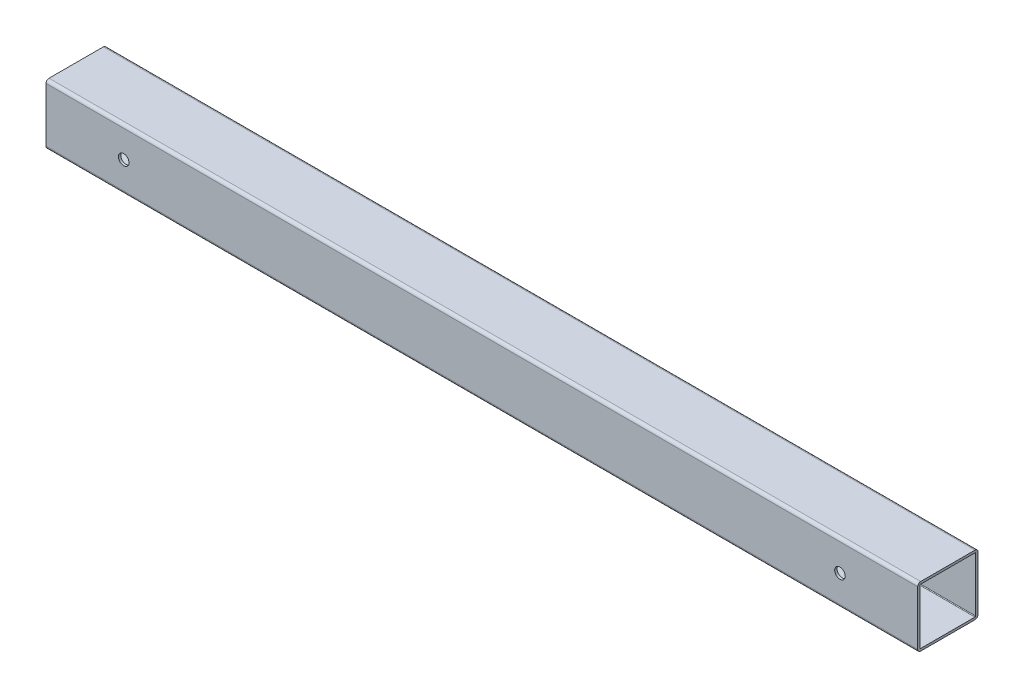
ISO-10303-21;
HEADER;
FILE_DESCRIPTION(('STEP AP214'),'2;1');
FILE_NAME('part.step','',(''),(''),'','','');
FILE_SCHEMA(('AUTOMOTIVE_DESIGN { 1 0 10303 214 1 1 1 1 }'));
ENDSEC;
DATA;
#1=APPLICATION_CONTEXT('core data for automotive mechanical design processes');
#2=APPLICATION_PROTOCOL_DEFINITION('international standard','automotive_design',2000,#1);
#3=PRODUCT_CONTEXT('',#1,'mechanical');
#4=PRODUCT('Part','Part','',(#3));
#5=PRODUCT_RELATED_PRODUCT_CATEGORY('part','',(#4));
#6=PRODUCT_DEFINITION_FORMATION('','',#4);
#7=PRODUCT_DEFINITION_CONTEXT('part definition',#1,'design');
#8=PRODUCT_DEFINITION('design','',#6,#7);
#9=PRODUCT_DEFINITION_SHAPE('','',#8);
#10=(LENGTH_UNIT() NAMED_UNIT(*) SI_UNIT(.MILLI.,.METRE.));
#11=(NAMED_UNIT(*) PLANE_ANGLE_UNIT() SI_UNIT($,.RADIAN.));
#12=(NAMED_UNIT(*) SI_UNIT($,.STERADIAN.) SOLID_ANGLE_UNIT());
#13=UNCERTAINTY_MEASURE_WITH_UNIT(LENGTH_MEASURE(1.E-05),#10,'distance_accuracy_value','');
#14=(GEOMETRIC_REPRESENTATION_CONTEXT(3) GLOBAL_UNCERTAINTY_ASSIGNED_CONTEXT((#13)) GLOBAL_UNIT_ASSIGNED_CONTEXT((#10,
#11,#12)) REPRESENTATION_CONTEXT('',''));
#15=CARTESIAN_POINT('',(0.,0.,0.));
#16=DIRECTION('',(0.,0.,1.));
#17=DIRECTION('',(1.,0.,0.));
#18=AXIS2_PLACEMENT_3D('',#15,#16,#17);
#19=CARTESIAN_POINT('',(289.026800000006,18.,18.));
#20=DIRECTION('',(-1.,0.,0.));
#21=DIRECTION('',(0.,-1.,0.));
#22=AXIS2_PLACEMENT_3D('',#19,#20,#21);
#23=CYLINDRICAL_SURFACE('',#22,2.00000000000001);
#24=CARTESIAN_POINT('',(-289.026800000006,17.9999999999999,18.));
#25=DIRECTION('',(1.,0.,0.));
#26=DIRECTION('',(0.,1.,0.));
#27=AXIS2_PLACEMENT_3D('',#24,#25,#26);
#28=CIRCLE('',#27,2.00000000000001);
#29=CARTESIAN_POINT('',(-289.026800000006,19.9999999999999,18.));
#30=VERTEX_POINT('',#29);
#31=CARTESIAN_POINT('',(-289.026800000006,17.9999999999999,20.));
#32=VERTEX_POINT('',#31);
#33=EDGE_CURVE('E238',#30,#32,#28,.T.);
#34=ORIENTED_EDGE('',*,*,#33,.T.);
#35=DIRECTION('',(-1.,0.,0.));
#36=VECTOR('',#35,1.);
#37=CARTESIAN_POINT('',(289.026800000006,18.,20.));
#38=LINE('',#37,#36);
#39=CARTESIAN_POINT('',(289.026800000006,18.,20.));
#40=VERTEX_POINT('',#39);
#41=EDGE_CURVE('E12',#40,#32,#38,.T.);
#42=ORIENTED_EDGE('',*,*,#41,.F.);
#43=CARTESIAN_POINT('',(289.026800000006,18.,18.));
#44=DIRECTION('',(1.,0.,0.));
#45=DIRECTION('',(0.,1.,0.));
#46=AXIS2_PLACEMENT_3D('',#43,#44,#45);
#47=CIRCLE('',#46,2.00000000000001);
#48=CARTESIAN_POINT('',(289.026800000006,20.,18.));
#49=VERTEX_POINT('',#48);
#50=EDGE_CURVE('E324',#49,#40,#47,.T.);
#51=ORIENTED_EDGE('',*,*,#50,.F.);
#52=DIRECTION('',(-1.,0.,0.));
#53=VECTOR('',#52,1.);
#54=CARTESIAN_POINT('',(289.026800000006,20.,18.));
#55=LINE('',#54,#53);
#56=EDGE_CURVE('E253',#49,#30,#55,.T.);
#57=ORIENTED_EDGE('',*,*,#56,.T.);
#58=EDGE_LOOP('',(#34,#42,#51,#57));
#59=FACE_BOUND('',#58,.T.);
#60=ADVANCED_FACE('F64',(#59),#23,.T.);
#61=CARTESIAN_POINT('',(289.026800000006,18.,20.));
#62=DIRECTION('',(0.,0.,-1.));
#63=DIRECTION('',(0.,1.,0.));
#64=AXIS2_PLACEMENT_3D('',#61,#62,#63);
#65=PLANE('',#64);
#66=CARTESIAN_POINT('',(237.500000000003,-1.04249065572092E-13,20.));
#67=DIRECTION('',(0.,0.,-1.));
#68=DIRECTION('',(0.,1.,0.));
#69=AXIS2_PLACEMENT_3D('',#66,#67,#68);
#70=CIRCLE('',#69,3.49999999999999);
#71=CARTESIAN_POINT('',(237.500000000003,3.49999999999989,20.));
#72=VERTEX_POINT('',#71);
#73=EDGE_CURVE('E281',#72,#72,#70,.T.);
#74=ORIENTED_EDGE('',*,*,#73,.T.);
#75=EDGE_LOOP('',(#74));
#76=FACE_BOUND('',#75,.T.);
#77=CARTESIAN_POINT('',(-237.500000000003,0.,20.));
#78=DIRECTION('',(0.,0.,-1.));
#79=DIRECTION('',(0.,-1.,0.));
#80=AXIS2_PLACEMENT_3D('',#77,#78,#79);
#81=CIRCLE('',#80,3.49999999999999);
#82=CARTESIAN_POINT('',(-237.500000000003,-3.50000000000004,20.));
#83=VERTEX_POINT('',#82);
#84=EDGE_CURVE('E288',#83,#83,#81,.T.);
#85=ORIENTED_EDGE('',*,*,#84,.T.);
#86=EDGE_LOOP('',(#85));
#87=FACE_BOUND('',#86,.T.);
#88=DIRECTION('',(0.,-1.,0.));
#89=VECTOR('',#88,1.);
#90=CARTESIAN_POINT('',(-289.026800000006,17.9999999999999,20.));
#91=LINE('',#90,#89);
#92=CARTESIAN_POINT('',(-289.026800000006,-18.0000000000001,20.));
#93=VERTEX_POINT('',#92);
#94=EDGE_CURVE('E241',#32,#93,#91,.T.);
#95=ORIENTED_EDGE('',*,*,#94,.T.);
#96=DIRECTION('',(-1.,0.,0.));
#97=VECTOR('',#96,1.);
#98=CARTESIAN_POINT('',(289.026800000006,-18.,20.));
#99=LINE('',#98,#97);
#100=CARTESIAN_POINT('',(289.026800000006,-18.,20.));
#101=VERTEX_POINT('',#100);
#102=EDGE_CURVE('E74',#101,#93,#99,.T.);
#103=ORIENTED_EDGE('',*,*,#102,.F.);
#104=DIRECTION('',(0.,-1.,0.));
#105=VECTOR('',#104,1.);
#106=CARTESIAN_POINT('',(289.026800000006,18.,20.));
#107=LINE('',#106,#105);
#108=EDGE_CURVE('E326',#40,#101,#107,.T.);
#109=ORIENTED_EDGE('',*,*,#108,.F.);
#110=ORIENTED_EDGE('',*,*,#41,.T.);
#111=EDGE_LOOP('',(#95,#103,#109,#110));
#112=FACE_BOUND('',#111,.T.);
#113=ADVANCED_FACE('F364',(#76,#87,#112),#65,.F.);
#114=CARTESIAN_POINT('',(289.026800000006,-18.,18.));
#115=DIRECTION('',(-1.,0.,0.));
#116=DIRECTION('',(0.,-1.,0.));
#117=AXIS2_PLACEMENT_3D('',#114,#115,#116);
#118=CYLINDRICAL_SURFACE('',#117,2.00000000000001);
#119=CARTESIAN_POINT('',(-289.026800000006,-18.0000000000001,18.));
#120=DIRECTION('',(1.,0.,0.));
#121=DIRECTION('',(0.,1.,0.));
#122=AXIS2_PLACEMENT_3D('',#119,#120,#121);
#123=CIRCLE('',#122,2.00000000000001);
#124=CARTESIAN_POINT('',(-289.026800000006,-20.0000000000001,18.));
#125=VERTEX_POINT('',#124);
#126=EDGE_CURVE('E243',#93,#125,#123,.T.);
#127=ORIENTED_EDGE('',*,*,#126,.T.);
#128=DIRECTION('',(-1.,0.,0.));
#129=VECTOR('',#128,1.);
#130=CARTESIAN_POINT('',(289.026800000006,-20.,18.));
#131=LINE('',#130,#129);
#132=CARTESIAN_POINT('',(289.026800000006,-20.,18.));
#133=VERTEX_POINT('',#132);
#134=EDGE_CURVE('E260',#133,#125,#131,.T.);
#135=ORIENTED_EDGE('',*,*,#134,.F.);
#136=CARTESIAN_POINT('',(289.026800000006,-18.,18.));
#137=DIRECTION('',(1.,0.,0.));
#138=DIRECTION('',(0.,1.,0.));
#139=AXIS2_PLACEMENT_3D('',#136,#137,#138);
#140=CIRCLE('',#139,2.00000000000001);
#141=EDGE_CURVE('E328',#101,#133,#140,.T.);
#142=ORIENTED_EDGE('',*,*,#141,.F.);
#143=ORIENTED_EDGE('',*,*,#102,.T.);
#144=EDGE_LOOP('',(#127,#135,#142,#143));
#145=FACE_BOUND('',#144,.T.);
#146=ADVANCED_FACE('F369',(#145),#118,.T.);
#147=CARTESIAN_POINT('',(289.026800000006,-20.,-18.));
#148=DIRECTION('',(0.,1.,0.));
#149=DIRECTION('',(0.,0.,1.));
#150=AXIS2_PLACEMENT_3D('',#147,#148,#149);
#151=PLANE('',#150);
#152=DIRECTION('',(0.,0.,-1.));
#153=VECTOR('',#152,1.);
#154=CARTESIAN_POINT('',(-289.026800000006,-20.0000000000001,-18.));
#155=LINE('',#154,#153);
#156=CARTESIAN_POINT('',(-289.026800000006,-20.0000000000001,-18.));
#157=VERTEX_POINT('',#156);
#158=EDGE_CURVE('E245',#125,#157,#155,.T.);
#159=ORIENTED_EDGE('',*,*,#158,.T.);
#160=DIRECTION('',(-1.,0.,0.));
#161=VECTOR('',#160,1.);
#162=CARTESIAN_POINT('',(289.026800000006,-20.,-18.));
#163=LINE('',#162,#161);
#164=CARTESIAN_POINT('',(289.026800000006,-20.,-18.));
#165=VERTEX_POINT('',#164);
#166=EDGE_CURVE('E257',#165,#157,#163,.T.);
#167=ORIENTED_EDGE('',*,*,#166,.F.);
#168=DIRECTION('',(0.,0.,-1.));
#169=VECTOR('',#168,1.);
#170=CARTESIAN_POINT('',(289.026800000006,-20.,-18.));
#171=LINE('',#170,#169);
#172=EDGE_CURVE('E330',#133,#165,#171,.T.);
#173=ORIENTED_EDGE('',*,*,#172,.F.);
#174=ORIENTED_EDGE('',*,*,#134,.T.);
#175=EDGE_LOOP('',(#159,#167,#173,#174));
#176=FACE_BOUND('',#175,.T.);
#177=ADVANCED_FACE('F336',(#176),#151,.F.);
#178=CARTESIAN_POINT('',(289.026800000006,-18.,-18.));
#179=DIRECTION('',(-1.,0.,0.));
#180=DIRECTION('',(0.,-1.,0.));
#181=AXIS2_PLACEMENT_3D('',#178,#179,#180);
#182=CYLINDRICAL_SURFACE('',#181,2.00000000000001);
#183=CARTESIAN_POINT('',(-289.026800000006,-18.0000000000001,-18.));
#184=DIRECTION('',(1.,0.,0.));
#185=DIRECTION('',(0.,1.,0.));
#186=AXIS2_PLACEMENT_3D('',#183,#184,#185);
#187=CIRCLE('',#186,2.00000000000001);
#188=CARTESIAN_POINT('',(-289.026800000006,-18.0000000000001,-20.));
#189=VERTEX_POINT('',#188);
#190=EDGE_CURVE('E247',#157,#189,#187,.T.);
#191=ORIENTED_EDGE('',*,*,#190,.T.);
#192=DIRECTION('',(-1.,0.,0.));
#193=VECTOR('',#192,1.);
#194=CARTESIAN_POINT('',(289.026800000006,-18.,-20.));
#195=LINE('',#194,#193);
#196=CARTESIAN_POINT('',(289.026800000006,-18.,-20.));
#197=VERTEX_POINT('',#196);
#198=EDGE_CURVE('E204',#197,#189,#195,.T.);
#199=ORIENTED_EDGE('',*,*,#198,.F.);
#200=CARTESIAN_POINT('',(289.026800000006,-18.,-18.));
#201=DIRECTION('',(1.,0.,0.));
#202=DIRECTION('',(0.,1.,0.));
#203=AXIS2_PLACEMENT_3D('',#200,#201,#202);
#204=CIRCLE('',#203,2.00000000000001);
#205=EDGE_CURVE('E195',#165,#197,#204,.T.);
#206=ORIENTED_EDGE('',*,*,#205,.F.);
#207=ORIENTED_EDGE('',*,*,#166,.T.);
#208=EDGE_LOOP('',(#191,#199,#206,#207));
#209=FACE_BOUND('',#208,.T.);
#210=ADVANCED_FACE('F340',(#209),#182,.T.);
#211=CARTESIAN_POINT('',(289.026800000006,-18.,-20.));
#212=DIRECTION('',(0.,0.,1.));
#213=DIRECTION('',(0.,-1.,0.));
#214=AXIS2_PLACEMENT_3D('',#211,#212,#213);
#215=PLANE('',#214);
#216=CARTESIAN_POINT('',(237.500000000003,-1.08104006629818E-13,-20.));
#217=DIRECTION('',(0.,0.,1.));
#218=DIRECTION('',(0.,-1.,0.));
#219=AXIS2_PLACEMENT_3D('',#216,#217,#218);
#220=CIRCLE('',#219,3.49999999999999);
#221=CARTESIAN_POINT('',(237.500000000003,-3.5000000000001,-20.));
#222=VERTEX_POINT('',#221);
#223=EDGE_CURVE('E217',#222,#222,#220,.T.);
#224=ORIENTED_EDGE('',*,*,#223,.T.);
#225=EDGE_LOOP('',(#224));
#226=FACE_BOUND('',#225,.T.);
#227=CARTESIAN_POINT('',(-237.500000000003,0.,-20.));
#228=DIRECTION('',(0.,0.,1.));
#229=DIRECTION('',(0.,-1.,0.));
#230=AXIS2_PLACEMENT_3D('',#227,#228,#229);
#231=CIRCLE('',#230,3.49999999999999);
#232=CARTESIAN_POINT('',(-237.500000000003,-3.50000000000004,-20.));
#233=VERTEX_POINT('',#232);
#234=EDGE_CURVE('E285',#233,#233,#231,.T.);
#235=ORIENTED_EDGE('',*,*,#234,.T.);
#236=EDGE_LOOP('',(#235));
#237=FACE_BOUND('',#236,.T.);
#238=DIRECTION('',(0.,1.,0.));
#239=VECTOR('',#238,1.);
#240=CARTESIAN_POINT('',(-289.026800000006,-18.0000000000001,-20.));
#241=LINE('',#240,#239);
#242=CARTESIAN_POINT('',(-289.026800000006,17.9999999999999,-20.));
#243=VERTEX_POINT('',#242);
#244=EDGE_CURVE('E203',#189,#243,#241,.T.);
#245=ORIENTED_EDGE('',*,*,#244,.T.);
#246=DIRECTION('',(-1.,0.,0.));
#247=VECTOR('',#246,1.);
#248=CARTESIAN_POINT('',(289.026800000006,18.,-20.));
#249=LINE('',#248,#247);
#250=CARTESIAN_POINT('',(289.026800000006,18.,-20.));
#251=VERTEX_POINT('',#250);
#252=EDGE_CURVE('E200',#251,#243,#249,.T.);
#253=ORIENTED_EDGE('',*,*,#252,.F.);
#254=DIRECTION('',(0.,1.,0.));
#255=VECTOR('',#254,1.);
#256=CARTESIAN_POINT('',(289.026800000006,-18.,-20.));
#257=LINE('',#256,#255);
#258=EDGE_CURVE('E189',#197,#251,#257,.T.);
#259=ORIENTED_EDGE('',*,*,#258,.F.);
#260=ORIENTED_EDGE('',*,*,#198,.T.);
#261=EDGE_LOOP('',(#245,#253,#259,#260));
#262=FACE_BOUND('',#261,.T.);
#263=ADVANCED_FACE('F201',(#226,#237,#262),#215,.F.);
#264=CARTESIAN_POINT('',(289.026800000006,18.,-18.));
#265=DIRECTION('',(-1.,0.,0.));
#266=DIRECTION('',(0.,-1.,0.));
#267=AXIS2_PLACEMENT_3D('',#264,#265,#266);
#268=CYLINDRICAL_SURFACE('',#267,2.00000000000001);
#269=CARTESIAN_POINT('',(-289.026800000006,17.9999999999999,-18.));
#270=DIRECTION('',(1.,0.,0.));
#271=DIRECTION('',(0.,1.,0.));
#272=AXIS2_PLACEMENT_3D('',#269,#270,#271);
#273=CIRCLE('',#272,2.00000000000001);
#274=CARTESIAN_POINT('',(-289.026800000006,19.9999999999999,-18.));
#275=VERTEX_POINT('',#274);
#276=EDGE_CURVE('E136',#243,#275,#273,.T.);
#277=ORIENTED_EDGE('',*,*,#276,.T.);
#278=DIRECTION('',(-1.,0.,0.));
#279=VECTOR('',#278,1.);
#280=CARTESIAN_POINT('',(289.026800000006,20.,-18.));
#281=LINE('',#280,#279);
#282=CARTESIAN_POINT('',(289.026800000006,20.,-18.));
#283=VERTEX_POINT('',#282);
#284=EDGE_CURVE('E205',#283,#275,#281,.T.);
#285=ORIENTED_EDGE('',*,*,#284,.F.);
#286=CARTESIAN_POINT('',(289.026800000006,18.,-18.));
#287=DIRECTION('',(1.,0.,0.));
#288=DIRECTION('',(0.,1.,0.));
#289=AXIS2_PLACEMENT_3D('',#286,#287,#288);
#290=CIRCLE('',#289,2.00000000000001);
#291=EDGE_CURVE('E193',#251,#283,#290,.T.);
#292=ORIENTED_EDGE('',*,*,#291,.F.);
#293=ORIENTED_EDGE('',*,*,#252,.T.);
#294=EDGE_LOOP('',(#277,#285,#292,#293));
#295=FACE_BOUND('',#294,.T.);
#296=ADVANCED_FACE('F207',(#295),#268,.T.);
#297=CARTESIAN_POINT('',(289.026800000006,-18.,18.));
#298=DIRECTION('',(-1.,0.,0.));
#299=DIRECTION('',(0.,-1.,0.));
#300=AXIS2_PLACEMENT_3D('',#297,#298,#299);
#301=CYLINDRICAL_SURFACE('',#300,0.450000000000003);
#302=CARTESIAN_POINT('',(-289.026800000006,-18.0000000000001,18.));
#303=DIRECTION('',(1.,0.,0.));
#304=DIRECTION('',(0.,1.,0.));
#305=AXIS2_PLACEMENT_3D('',#302,#303,#304);
#306=CIRCLE('',#305,0.450000000000003);
#307=CARTESIAN_POINT('',(-289.026800000006,-18.0000000000001,18.45));
#308=VERTEX_POINT('',#307);
#309=CARTESIAN_POINT('',(-289.026800000006,-18.4500000000001,18.));
#310=VERTEX_POINT('',#309);
#311=EDGE_CURVE('E213',#308,#310,#306,.T.);
#312=ORIENTED_EDGE('',*,*,#311,.F.);
#313=DIRECTION('',(-1.,0.,0.));
#314=VECTOR('',#313,1.);
#315=CARTESIAN_POINT('',(289.026800000006,-18.,18.45));
#316=LINE('',#315,#314);
#317=CARTESIAN_POINT('',(289.026800000006,-18.,18.45));
#318=VERTEX_POINT('',#317);
#319=EDGE_CURVE('E150',#318,#308,#316,.T.);
#320=ORIENTED_EDGE('',*,*,#319,.F.);
#321=CARTESIAN_POINT('',(289.026800000006,-18.,18.));
#322=DIRECTION('',(1.,0.,0.));
#323=DIRECTION('',(0.,1.,0.));
#324=AXIS2_PLACEMENT_3D('',#321,#322,#323);
#325=CIRCLE('',#324,0.450000000000003);
#326=CARTESIAN_POINT('',(289.026800000006,-18.45,18.));
#327=VERTEX_POINT('',#326);
#328=EDGE_CURVE('E252',#318,#327,#325,.T.);
#329=ORIENTED_EDGE('',*,*,#328,.T.);
#330=DIRECTION('',(-1.,0.,0.));
#331=VECTOR('',#330,1.);
#332=CARTESIAN_POINT('',(289.026800000006,-18.45,18.));
#333=LINE('',#332,#331);
#334=EDGE_CURVE('E209',#327,#310,#333,.T.);
#335=ORIENTED_EDGE('',*,*,#334,.T.);
#336=EDGE_LOOP('',(#312,#320,#329,#335));
#337=FACE_BOUND('',#336,.T.);
#338=ADVANCED_FACE('F66',(#337),#301,.F.);
#339=CARTESIAN_POINT('',(289.026800000006,18.,18.45));
#340=DIRECTION('',(0.,0.,-1.));
#341=DIRECTION('',(0.,1.,0.));
#342=AXIS2_PLACEMENT_3D('',#339,#340,#341);
#343=PLANE('',#342);
#344=CARTESIAN_POINT('',(237.500000000003,-1.04398444538079E-13,18.45));
#345=DIRECTION('',(0.,0.,-1.));
#346=DIRECTION('',(0.,1.,0.));
#347=AXIS2_PLACEMENT_3D('',#344,#345,#346);
#348=CIRCLE('',#347,3.49999999999999);
#349=CARTESIAN_POINT('',(237.500000000003,3.49999999999989,18.45));
#350=VERTEX_POINT('',#349);
#351=EDGE_CURVE('E297',#350,#350,#348,.T.);
#352=ORIENTED_EDGE('',*,*,#351,.F.);
#353=EDGE_LOOP('',(#352));
#354=FACE_BOUND('',#353,.T.);
#355=CARTESIAN_POINT('',(-237.500000000003,0.,18.45));
#356=DIRECTION('',(0.,0.,-1.));
#357=DIRECTION('',(0.,1.,0.));
#358=AXIS2_PLACEMENT_3D('',#355,#356,#357);
#359=CIRCLE('',#358,3.49999999999999);
#360=CARTESIAN_POINT('',(-237.500000000003,3.49999999999995,18.45));
#361=VERTEX_POINT('',#360);
#362=EDGE_CURVE('E280',#361,#361,#359,.T.);
#363=ORIENTED_EDGE('',*,*,#362,.F.);
#364=EDGE_LOOP('',(#363));
#365=FACE_BOUND('',#364,.T.);
#366=DIRECTION('',(0.,-1.,0.));
#367=VECTOR('',#366,1.);
#368=CARTESIAN_POINT('',(-289.026800000006,17.9999999999999,18.45));
#369=LINE('',#368,#367);
#370=CARTESIAN_POINT('',(-289.026800000006,17.9999999999999,18.45));
#371=VERTEX_POINT('',#370);
#372=EDGE_CURVE('E216',#371,#308,#369,.T.);
#373=ORIENTED_EDGE('',*,*,#372,.F.);
#374=DIRECTION('',(-1.,0.,0.));
#375=VECTOR('',#374,1.);
#376=CARTESIAN_POINT('',(289.026800000006,18.,18.45));
#377=LINE('',#376,#375);
#378=CARTESIAN_POINT('',(289.026800000006,18.,18.45));
#379=VERTEX_POINT('',#378);
#380=EDGE_CURVE('E276',#379,#371,#377,.T.);
#381=ORIENTED_EDGE('',*,*,#380,.F.);
#382=DIRECTION('',(0.,-1.,0.));
#383=VECTOR('',#382,1.);
#384=CARTESIAN_POINT('',(289.026800000006,18.,18.45));
#385=LINE('',#384,#383);
#386=EDGE_CURVE('E303',#379,#318,#385,.T.);
#387=ORIENTED_EDGE('',*,*,#386,.T.);
#388=ORIENTED_EDGE('',*,*,#319,.T.);
#389=EDGE_LOOP('',(#373,#381,#387,#388));
#390=FACE_BOUND('',#389,.T.);
#391=ADVANCED_FACE('F390',(#354,#365,#390),#343,.T.);
#392=CARTESIAN_POINT('',(289.026800000006,18.,18.));
#393=DIRECTION('',(-1.,0.,0.));
#394=DIRECTION('',(0.,-1.,0.));
#395=AXIS2_PLACEMENT_3D('',#392,#393,#394);
#396=CYLINDRICAL_SURFACE('',#395,0.450000000000003);
#397=CARTESIAN_POINT('',(-289.026800000006,17.9999999999999,18.));
#398=DIRECTION('',(1.,0.,0.));
#399=DIRECTION('',(0.,1.,0.));
#400=AXIS2_PLACEMENT_3D('',#397,#398,#399);
#401=CIRCLE('',#400,0.450000000000003);
#402=CARTESIAN_POINT('',(-289.026800000006,18.4499999999999,18.));
#403=VERTEX_POINT('',#402);
#404=EDGE_CURVE('E220',#403,#371,#401,.T.);
#405=ORIENTED_EDGE('',*,*,#404,.F.);
#406=DIRECTION('',(-1.,0.,0.));
#407=VECTOR('',#406,1.);
#408=CARTESIAN_POINT('',(289.026800000006,18.45,18.));
#409=LINE('',#408,#407);
#410=CARTESIAN_POINT('',(289.026800000006,18.45,18.));
#411=VERTEX_POINT('',#410);
#412=EDGE_CURVE('E274',#411,#403,#409,.T.);
#413=ORIENTED_EDGE('',*,*,#412,.F.);
#414=CARTESIAN_POINT('',(289.026800000006,18.,18.));
#415=DIRECTION('',(1.,0.,0.));
#416=DIRECTION('',(0.,1.,0.));
#417=AXIS2_PLACEMENT_3D('',#414,#415,#416);
#418=CIRCLE('',#417,0.450000000000003);
#419=EDGE_CURVE('E306',#411,#379,#418,.T.);
#420=ORIENTED_EDGE('',*,*,#419,.T.);
#421=ORIENTED_EDGE('',*,*,#380,.T.);
#422=EDGE_LOOP('',(#405,#413,#420,#421));
#423=FACE_BOUND('',#422,.T.);
#424=ADVANCED_FACE('F387',(#423),#396,.F.);
#425=CARTESIAN_POINT('',(289.026800000006,18.45,18.));
#426=DIRECTION('',(0.,-1.,0.));
#427=DIRECTION('',(1.,0.,0.));
#428=AXIS2_PLACEMENT_3D('',#425,#426,#427);
#429=PLANE('',#428);
#430=DIRECTION('',(0.,0.,1.));
#431=VECTOR('',#430,1.);
#432=CARTESIAN_POINT('',(-289.026800000006,18.4499999999999,18.));
#433=LINE('',#432,#431);
#434=CARTESIAN_POINT('',(-289.026800000006,18.4499999999999,-18.));
#435=VERTEX_POINT('',#434);
#436=EDGE_CURVE('E223',#435,#403,#433,.T.);
#437=ORIENTED_EDGE('',*,*,#436,.F.);
#438=DIRECTION('',(-1.,0.,0.));
#439=VECTOR('',#438,1.);
#440=CARTESIAN_POINT('',(289.026800000006,18.45,-18.));
#441=LINE('',#440,#439);
#442=CARTESIAN_POINT('',(289.026800000006,18.45,-18.));
#443=VERTEX_POINT('',#442);
#444=EDGE_CURVE('E272',#443,#435,#441,.T.);
#445=ORIENTED_EDGE('',*,*,#444,.F.);
#446=DIRECTION('',(0.,0.,1.));
#447=VECTOR('',#446,1.);
#448=CARTESIAN_POINT('',(289.026800000006,18.45,18.));
#449=LINE('',#448,#447);
#450=EDGE_CURVE('E309',#443,#411,#449,.T.);
#451=ORIENTED_EDGE('',*,*,#450,.T.);
#452=ORIENTED_EDGE('',*,*,#412,.T.);
#453=EDGE_LOOP('',(#437,#445,#451,#452));
#454=FACE_BOUND('',#453,.T.);
#455=ADVANCED_FACE('F383',(#454),#429,.T.);
#456=CARTESIAN_POINT('',(289.026800000006,18.,-18.));
#457=DIRECTION('',(-1.,0.,0.));
#458=DIRECTION('',(0.,-1.,0.));
#459=AXIS2_PLACEMENT_3D('',#456,#457,#458);
#460=CYLINDRICAL_SURFACE('',#459,0.450000000000003);
#461=CARTESIAN_POINT('',(-289.026800000006,17.9999999999999,-18.));
#462=DIRECTION('',(1.,0.,0.));
#463=DIRECTION('',(0.,1.,0.));
#464=AXIS2_PLACEMENT_3D('',#461,#462,#463);
#465=CIRCLE('',#464,0.450000000000003);
#466=CARTESIAN_POINT('',(-289.026800000006,17.9999999999999,-18.45));
#467=VERTEX_POINT('',#466);
#468=EDGE_CURVE('E226',#467,#435,#465,.T.);
#469=ORIENTED_EDGE('',*,*,#468,.F.);
#470=DIRECTION('',(-1.,0.,0.));
#471=VECTOR('',#470,1.);
#472=CARTESIAN_POINT('',(289.026800000006,18.,-18.45));
#473=LINE('',#472,#471);
#474=CARTESIAN_POINT('',(289.026800000006,18.,-18.45));
#475=VERTEX_POINT('',#474);
#476=EDGE_CURVE('E270',#475,#467,#473,.T.);
#477=ORIENTED_EDGE('',*,*,#476,.F.);
#478=CARTESIAN_POINT('',(289.026800000006,18.,-18.));
#479=DIRECTION('',(1.,0.,0.));
#480=DIRECTION('',(0.,1.,0.));
#481=AXIS2_PLACEMENT_3D('',#478,#479,#480);
#482=CIRCLE('',#481,0.450000000000003);
#483=EDGE_CURVE('E312',#475,#443,#482,.T.);
#484=ORIENTED_EDGE('',*,*,#483,.T.);
#485=ORIENTED_EDGE('',*,*,#444,.T.);
#486=EDGE_LOOP('',(#469,#477,#484,#485));
#487=FACE_BOUND('',#486,.T.);
#488=ADVANCED_FACE('F379',(#487),#460,.F.);
#489=CARTESIAN_POINT('',(289.026800000006,-18.,-18.45));
#490=DIRECTION('',(0.,0.,1.));
#491=DIRECTION('',(0.,-1.,0.));
#492=AXIS2_PLACEMENT_3D('',#489,#490,#491);
#493=PLANE('',#492);
#494=CARTESIAN_POINT('',(237.500000000003,-1.07954627663831E-13,-18.45));
#495=DIRECTION('',(0.,0.,1.));
#496=DIRECTION('',(0.,-1.,0.));
#497=AXIS2_PLACEMENT_3D('',#494,#495,#496);
#498=CIRCLE('',#497,3.49999999999999);
#499=CARTESIAN_POINT('',(237.500000000003,-3.5000000000001,-18.45));
#500=VERTEX_POINT('',#499);
#501=EDGE_CURVE('E68',#500,#500,#498,.T.);
#502=ORIENTED_EDGE('',*,*,#501,.F.);
#503=EDGE_LOOP('',(#502));
#504=FACE_BOUND('',#503,.T.);
#505=CARTESIAN_POINT('',(-237.500000000003,0.,-18.45));
#506=DIRECTION('',(0.,0.,1.));
#507=DIRECTION('',(0.,-1.,0.));
#508=AXIS2_PLACEMENT_3D('',#505,#506,#507);
#509=CIRCLE('',#508,3.49999999999999);
#510=CARTESIAN_POINT('',(-237.500000000003,-3.50000000000004,-18.45));
#511=VERTEX_POINT('',#510);
#512=EDGE_CURVE('E278',#511,#511,#509,.T.);
#513=ORIENTED_EDGE('',*,*,#512,.F.);
#514=EDGE_LOOP('',(#513));
#515=FACE_BOUND('',#514,.T.);
#516=DIRECTION('',(0.,1.,0.));
#517=VECTOR('',#516,1.);
#518=CARTESIAN_POINT('',(-289.026800000006,-18.0000000000001,-18.45));
#519=LINE('',#518,#517);
#520=CARTESIAN_POINT('',(-289.026800000006,-18.0000000000001,-18.45));
#521=VERTEX_POINT('',#520);
#522=EDGE_CURVE('E229',#521,#467,#519,.T.);
#523=ORIENTED_EDGE('',*,*,#522,.F.);
#524=DIRECTION('',(-1.,0.,0.));
#525=VECTOR('',#524,1.);
#526=CARTESIAN_POINT('',(289.026800000006,-18.,-18.45));
#527=LINE('',#526,#525);
#528=CARTESIAN_POINT('',(289.026800000006,-18.,-18.45));
#529=VERTEX_POINT('',#528);
#530=EDGE_CURVE('E268',#529,#521,#527,.T.);
#531=ORIENTED_EDGE('',*,*,#530,.F.);
#532=DIRECTION('',(0.,1.,0.));
#533=VECTOR('',#532,1.);
#534=CARTESIAN_POINT('',(289.026800000006,-18.,-18.45));
#535=LINE('',#534,#533);
#536=EDGE_CURVE('E315',#529,#475,#535,.T.);
#537=ORIENTED_EDGE('',*,*,#536,.T.);
#538=ORIENTED_EDGE('',*,*,#476,.T.);
#539=EDGE_LOOP('',(#523,#531,#537,#538));
#540=FACE_BOUND('',#539,.T.);
#541=ADVANCED_FACE('F375',(#504,#515,#540),#493,.T.);
#542=CARTESIAN_POINT('',(289.026800000006,-18.,-18.));
#543=DIRECTION('',(-1.,0.,0.));
#544=DIRECTION('',(0.,-1.,0.));
#545=AXIS2_PLACEMENT_3D('',#542,#543,#544);
#546=CYLINDRICAL_SURFACE('',#545,0.449999999999999);
#547=CARTESIAN_POINT('',(-289.026800000006,-18.0000000000001,-18.));
#548=DIRECTION('',(1.,0.,0.));
#549=DIRECTION('',(0.,1.,0.));
#550=AXIS2_PLACEMENT_3D('',#547,#548,#549);
#551=CIRCLE('',#550,0.449999999999999);
#552=CARTESIAN_POINT('',(-289.026800000006,-18.4500000000001,-18.));
#553=VERTEX_POINT('',#552);
#554=EDGE_CURVE('E232',#553,#521,#551,.T.);
#555=ORIENTED_EDGE('',*,*,#554,.F.);
#556=DIRECTION('',(-1.,0.,0.));
#557=VECTOR('',#556,1.);
#558=CARTESIAN_POINT('',(289.026800000006,-18.45,-18.));
#559=LINE('',#558,#557);
#560=CARTESIAN_POINT('',(289.026800000006,-18.45,-18.));
#561=VERTEX_POINT('',#560);
#562=EDGE_CURVE('E266',#561,#553,#559,.T.);
#563=ORIENTED_EDGE('',*,*,#562,.F.);
#564=CARTESIAN_POINT('',(289.026800000006,-18.,-18.));
#565=DIRECTION('',(1.,0.,0.));
#566=DIRECTION('',(0.,1.,0.));
#567=AXIS2_PLACEMENT_3D('',#564,#565,#566);
#568=CIRCLE('',#567,0.449999999999999);
#569=EDGE_CURVE('E318',#561,#529,#568,.T.);
#570=ORIENTED_EDGE('',*,*,#569,.T.);
#571=ORIENTED_EDGE('',*,*,#530,.T.);
#572=EDGE_LOOP('',(#555,#563,#570,#571));
#573=FACE_BOUND('',#572,.T.);
#574=ADVANCED_FACE('F358',(#573),#546,.F.);
#575=CARTESIAN_POINT('',(289.026800000006,-18.45,-18.));
#576=DIRECTION('',(0.,1.,0.));
#577=DIRECTION('',(0.,0.,1.));
#578=AXIS2_PLACEMENT_3D('',#575,#576,#577);
#579=PLANE('',#578);
#580=DIRECTION('',(0.,0.,-1.));
#581=VECTOR('',#580,1.);
#582=CARTESIAN_POINT('',(-289.026800000006,-18.4500000000001,-18.));
#583=LINE('',#582,#581);
#584=EDGE_CURVE('E235',#310,#553,#583,.T.);
#585=ORIENTED_EDGE('',*,*,#584,.F.);
#586=ORIENTED_EDGE('',*,*,#334,.F.);
#587=DIRECTION('',(0.,0.,-1.));
#588=VECTOR('',#587,1.);
#589=CARTESIAN_POINT('',(289.026800000006,-18.45,-18.));
#590=LINE('',#589,#588);
#591=EDGE_CURVE('E321',#327,#561,#590,.T.);
#592=ORIENTED_EDGE('',*,*,#591,.T.);
#593=ORIENTED_EDGE('',*,*,#562,.T.);
#594=EDGE_LOOP('',(#585,#586,#592,#593));
#595=FACE_BOUND('',#594,.T.);
#596=ADVANCED_FACE('F350',(#595),#579,.T.);
#597=CARTESIAN_POINT('',(289.026800000006,20.,18.));
#598=DIRECTION('',(0.,-1.,0.));
#599=DIRECTION('',(1.,0.,0.));
#600=AXIS2_PLACEMENT_3D('',#597,#598,#599);
#601=PLANE('',#600);
#602=DIRECTION('',(0.,0.,1.));
#603=VECTOR('',#602,1.);
#604=CARTESIAN_POINT('',(-289.026800000006,19.9999999999999,18.));
#605=LINE('',#604,#603);
#606=EDGE_CURVE('E142',#275,#30,#605,.T.);
#607=ORIENTED_EDGE('',*,*,#606,.T.);
#608=ORIENTED_EDGE('',*,*,#56,.F.);
#609=DIRECTION('',(0.,0.,1.));
#610=VECTOR('',#609,1.);
#611=CARTESIAN_POINT('',(289.026800000006,20.,18.));
#612=LINE('',#611,#610);
#613=EDGE_CURVE('E83',#283,#49,#612,.T.);
#614=ORIENTED_EDGE('',*,*,#613,.F.);
#615=ORIENTED_EDGE('',*,*,#284,.T.);
#616=EDGE_LOOP('',(#607,#608,#614,#615));
#617=FACE_BOUND('',#616,.T.);
#618=ADVANCED_FACE('F348',(#617),#601,.F.);
#619=CARTESIAN_POINT('',(289.026800000006,18.,18.));
#620=DIRECTION('',(1.,0.,0.));
#621=DIRECTION('',(0.,1.,0.));
#622=AXIS2_PLACEMENT_3D('',#619,#620,#621);
#623=PLANE('',#622);
#624=ORIENTED_EDGE('',*,*,#328,.F.);
#625=ORIENTED_EDGE('',*,*,#386,.F.);
#626=ORIENTED_EDGE('',*,*,#419,.F.);
#627=ORIENTED_EDGE('',*,*,#450,.F.);
#628=ORIENTED_EDGE('',*,*,#483,.F.);
#629=ORIENTED_EDGE('',*,*,#536,.F.);
#630=ORIENTED_EDGE('',*,*,#569,.F.);
#631=ORIENTED_EDGE('',*,*,#591,.F.);
#632=EDGE_LOOP('',(#624,#625,#626,#627,#628,#629,#630,#631));
#633=FACE_BOUND('',#632,.T.);
#634=ORIENTED_EDGE('',*,*,#50,.T.);
#635=ORIENTED_EDGE('',*,*,#108,.T.);
#636=ORIENTED_EDGE('',*,*,#141,.T.);
#637=ORIENTED_EDGE('',*,*,#172,.T.);
#638=ORIENTED_EDGE('',*,*,#205,.T.);
#639=ORIENTED_EDGE('',*,*,#258,.T.);
#640=ORIENTED_EDGE('',*,*,#291,.T.);
#641=ORIENTED_EDGE('',*,*,#613,.T.);
#642=EDGE_LOOP('',(#634,#635,#636,#637,#638,#639,#640,#641));
#643=FACE_BOUND('',#642,.T.);
#644=ADVANCED_FACE('F191',(#633,#643),#623,.T.);
#645=CARTESIAN_POINT('',(-289.026800000006,17.9999999999999,18.));
#646=DIRECTION('',(1.,0.,0.));
#647=DIRECTION('',(0.,1.,0.));
#648=AXIS2_PLACEMENT_3D('',#645,#646,#647);
#649=PLANE('',#648);
#650=ORIENTED_EDGE('',*,*,#311,.T.);
#651=ORIENTED_EDGE('',*,*,#584,.T.);
#652=ORIENTED_EDGE('',*,*,#554,.T.);
#653=ORIENTED_EDGE('',*,*,#522,.T.);
#654=ORIENTED_EDGE('',*,*,#468,.T.);
#655=ORIENTED_EDGE('',*,*,#436,.T.);
#656=ORIENTED_EDGE('',*,*,#404,.T.);
#657=ORIENTED_EDGE('',*,*,#372,.T.);
#658=EDGE_LOOP('',(#650,#651,#652,#653,#654,#655,#656,#657));
#659=FACE_BOUND('',#658,.T.);
#660=ORIENTED_EDGE('',*,*,#33,.F.);
#661=ORIENTED_EDGE('',*,*,#606,.F.);
#662=ORIENTED_EDGE('',*,*,#276,.F.);
#663=ORIENTED_EDGE('',*,*,#244,.F.);
#664=ORIENTED_EDGE('',*,*,#190,.F.);
#665=ORIENTED_EDGE('',*,*,#158,.F.);
#666=ORIENTED_EDGE('',*,*,#126,.F.);
#667=ORIENTED_EDGE('',*,*,#94,.F.);
#668=EDGE_LOOP('',(#660,#661,#662,#663,#664,#665,#666,#667));
#669=FACE_BOUND('',#668,.T.);
#670=ADVANCED_FACE('F343',(#659,#669),#649,.F.);
#671=CARTESIAN_POINT('',(-237.500000000003,0.,20.));
#672=DIRECTION('',(0.,0.,-1.));
#673=DIRECTION('',(0.,1.,0.));
#674=AXIS2_PLACEMENT_3D('',#671,#672,#673);
#675=CYLINDRICAL_SURFACE('',#674,3.49999999999999);
#676=ORIENTED_EDGE('',*,*,#512,.T.);
#677=EDGE_LOOP('',(#676));
#678=FACE_BOUND('',#677,.T.);
#679=ORIENTED_EDGE('',*,*,#234,.F.);
#680=EDGE_LOOP('',(#679));
#681=FACE_BOUND('',#680,.T.);
#682=ADVANCED_FACE('F418',(#678,#681),#675,.F.);
#683=CARTESIAN_POINT('',(237.500000000003,-1.04249065572092E-13,20.));
#684=DIRECTION('',(0.,0.,-1.));
#685=DIRECTION('',(0.,1.,0.));
#686=AXIS2_PLACEMENT_3D('',#683,#684,#685);
#687=CYLINDRICAL_SURFACE('',#686,3.49999999999999);
#688=ORIENTED_EDGE('',*,*,#501,.T.);
#689=EDGE_LOOP('',(#688));
#690=FACE_BOUND('',#689,.T.);
#691=ORIENTED_EDGE('',*,*,#223,.F.);
#692=EDGE_LOOP('',(#691));
#693=FACE_BOUND('',#692,.T.);
#694=ADVANCED_FACE('F422',(#690,#693),#687,.F.);
#695=ORIENTED_EDGE('',*,*,#362,.T.);
#696=EDGE_LOOP('',(#695));
#697=FACE_BOUND('',#696,.T.);
#698=ORIENTED_EDGE('',*,*,#84,.F.);
#699=EDGE_LOOP('',(#698));
#700=FACE_BOUND('',#699,.T.);
#701=ADVANCED_FACE('F424',(#697,#700),#675,.F.);
#702=ORIENTED_EDGE('',*,*,#351,.T.);
#703=EDGE_LOOP('',(#702));
#704=FACE_BOUND('',#703,.T.);
#705=ORIENTED_EDGE('',*,*,#73,.F.);
#706=EDGE_LOOP('',(#705));
#707=FACE_BOUND('',#706,.T.);
#708=ADVANCED_FACE('F428',(#704,#707),#687,.F.);
#709=CLOSED_SHELL('',(#60,#113,#146,#177,#210,#263,#296,#338,#391,#424,#455,#488,#541,#574,#596,
#618,#644,#670,#682,#694,#701,#708));
#710=MANIFOLD_SOLID_BREP('B2',#709);
#711=ADVANCED_BREP_SHAPE_REPRESENTATION('',(#18,#710),#14);
#712=SHAPE_DEFINITION_REPRESENTATION(#9,#711);
ENDSEC;
END-ISO-10303-21;
